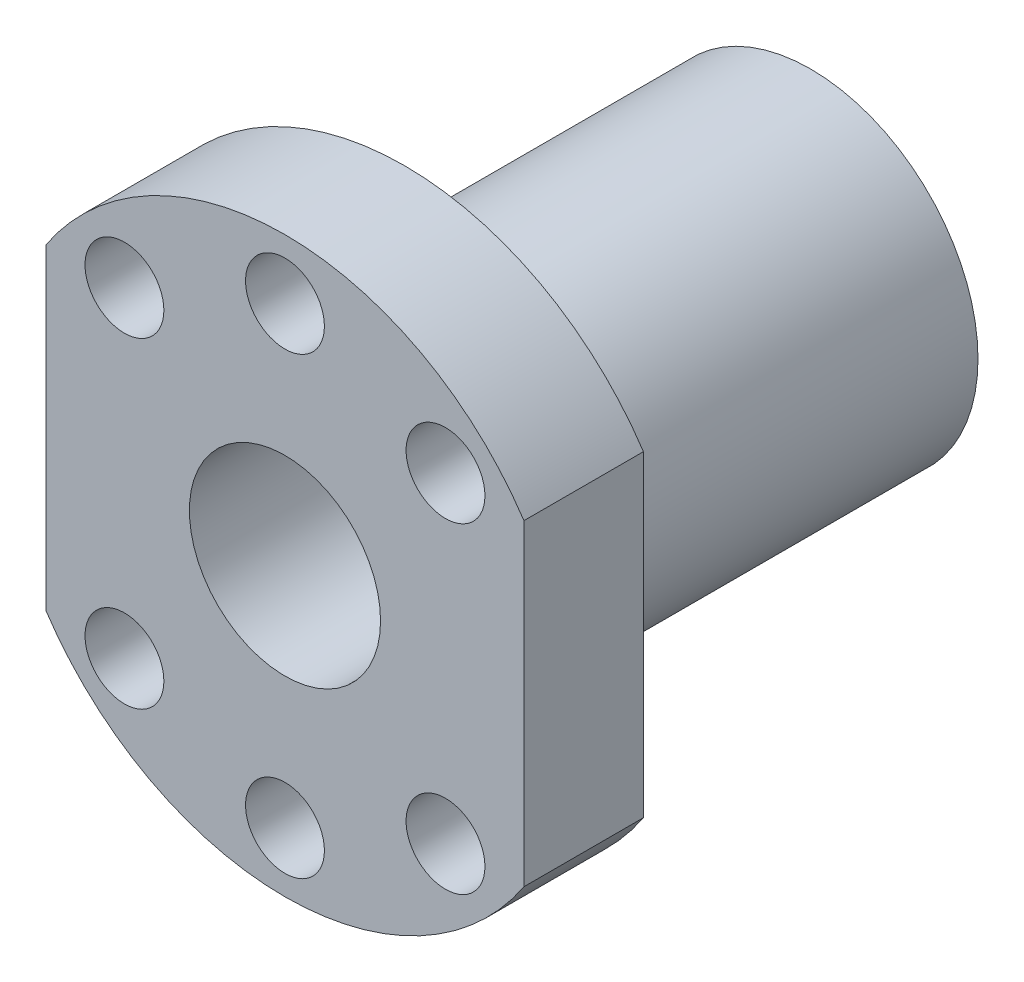
ISO-10303-21;
HEADER;
FILE_DESCRIPTION(('STEP AP214'),'2;1');
FILE_NAME('part.step','',(''),(''),'','','');
FILE_SCHEMA(('AUTOMOTIVE_DESIGN { 1 0 10303 214 1 1 1 1 }'));
ENDSEC;
DATA;
#1=APPLICATION_CONTEXT('core data for automotive mechanical design processes');
#2=APPLICATION_PROTOCOL_DEFINITION('international standard','automotive_design',2000,#1);
#3=PRODUCT_CONTEXT('',#1,'mechanical');
#4=PRODUCT('Part','Part','',(#3));
#5=PRODUCT_RELATED_PRODUCT_CATEGORY('part','',(#4));
#6=PRODUCT_DEFINITION_FORMATION('','',#4);
#7=PRODUCT_DEFINITION_CONTEXT('part definition',#1,'design');
#8=PRODUCT_DEFINITION('design','',#6,#7);
#9=PRODUCT_DEFINITION_SHAPE('','',#8);
#10=(LENGTH_UNIT() NAMED_UNIT(*) SI_UNIT(.MILLI.,.METRE.));
#11=(NAMED_UNIT(*) PLANE_ANGLE_UNIT() SI_UNIT($,.RADIAN.));
#12=(NAMED_UNIT(*) SI_UNIT($,.STERADIAN.) SOLID_ANGLE_UNIT());
#13=UNCERTAINTY_MEASURE_WITH_UNIT(LENGTH_MEASURE(1.E-05),#10,'distance_accuracy_value','');
#14=(GEOMETRIC_REPRESENTATION_CONTEXT(3) GLOBAL_UNCERTAINTY_ASSIGNED_CONTEXT((#13)) GLOBAL_UNIT_ASSIGNED_CONTEXT((#10,
#11,#12)) REPRESENTATION_CONTEXT('',''));
#15=CARTESIAN_POINT('',(0.,0.,0.));
#16=DIRECTION('',(0.,0.,1.));
#17=DIRECTION('',(1.,0.,0.));
#18=AXIS2_PLACEMENT_3D('',#15,#16,#17);
#19=CARTESIAN_POINT('',(0.,24.,0.));
#20=DIRECTION('',(0.,0.,-1.));
#21=DIRECTION('',(-1.,0.,0.));
#22=AXIS2_PLACEMENT_3D('',#19,#20,#21);
#23=PLANE('',#22);
#24=CARTESIAN_POINT('',(0.,-19.,0.));
#25=DIRECTION('',(0.,0.,-1.));
#26=DIRECTION('',(1.,0.,0.));
#27=AXIS2_PLACEMENT_3D('',#24,#25,#26);
#28=CIRCLE('',#27,3.3);
#29=CARTESIAN_POINT('',(3.3,-19.,0.));
#30=VERTEX_POINT('',#29);
#31=EDGE_CURVE('E127',#30,#30,#28,.T.);
#32=ORIENTED_EDGE('',*,*,#31,.T.);
#33=EDGE_LOOP('',(#32));
#34=FACE_BOUND('',#33,.T.);
#35=CARTESIAN_POINT('',(0.,0.,0.));
#36=DIRECTION('',(0.,0.,1.));
#37=DIRECTION('',(1.,0.,0.));
#38=AXIS2_PLACEMENT_3D('',#35,#36,#37);
#39=CIRCLE('',#38,24.);
#40=CARTESIAN_POINT('',(20.,13.2664991614216,0.));
#41=VERTEX_POINT('',#40);
#42=CARTESIAN_POINT('',(-20.,13.2664991614216,0.));
#43=VERTEX_POINT('',#42);
#44=EDGE_CURVE('E87',#41,#43,#39,.T.);
#45=ORIENTED_EDGE('',*,*,#44,.T.);
#46=DIRECTION('',(0.,1.,0.));
#47=VECTOR('',#46,1.);
#48=CARTESIAN_POINT('',(-20.,13.2664991614216,0.));
#49=LINE('',#48,#47);
#50=CARTESIAN_POINT('',(-20.,-13.2664991614216,0.));
#51=VERTEX_POINT('',#50);
#52=EDGE_CURVE('E74',#51,#43,#49,.T.);
#53=ORIENTED_EDGE('',*,*,#52,.F.);
#54=CARTESIAN_POINT('',(20.,-13.2664991614216,0.));
#55=VERTEX_POINT('',#54);
#56=EDGE_CURVE('E84',#51,#55,#39,.T.);
#57=ORIENTED_EDGE('',*,*,#56,.T.);
#58=DIRECTION('',(0.,-1.,0.));
#59=VECTOR('',#58,1.);
#60=CARTESIAN_POINT('',(20.,-13.2664991614216,0.));
#61=LINE('',#60,#59);
#62=EDGE_CURVE('E94',#41,#55,#61,.T.);
#63=ORIENTED_EDGE('',*,*,#62,.F.);
#64=EDGE_LOOP('',(#45,#53,#57,#63));
#65=FACE_BOUND('',#64,.T.);
#66=CARTESIAN_POINT('',(-13.4350288425444,13.4350288425444,0.));
#67=DIRECTION('',(0.,0.,1.));
#68=DIRECTION('',(1.,0.,0.));
#69=AXIS2_PLACEMENT_3D('',#66,#67,#68);
#70=CIRCLE('',#69,3.3);
#71=CARTESIAN_POINT('',(-10.1350288425444,13.4350288425444,0.));
#72=VERTEX_POINT('',#71);
#73=EDGE_CURVE('E112',#72,#72,#70,.T.);
#74=ORIENTED_EDGE('',*,*,#73,.F.);
#75=EDGE_LOOP('',(#74));
#76=FACE_BOUND('',#75,.T.);
#77=CARTESIAN_POINT('',(0.,19.,0.));
#78=DIRECTION('',(0.,0.,1.));
#79=DIRECTION('',(1.,0.,0.));
#80=AXIS2_PLACEMENT_3D('',#77,#78,#79);
#81=CIRCLE('',#80,3.3);
#82=CARTESIAN_POINT('',(3.3,19.,0.));
#83=VERTEX_POINT('',#82);
#84=EDGE_CURVE('E116',#83,#83,#81,.T.);
#85=ORIENTED_EDGE('',*,*,#84,.F.);
#86=EDGE_LOOP('',(#85));
#87=FACE_BOUND('',#86,.T.);
#88=CARTESIAN_POINT('',(13.4350288425444,13.4350288425444,0.));
#89=DIRECTION('',(0.,0.,1.));
#90=DIRECTION('',(1.,0.,0.));
#91=AXIS2_PLACEMENT_3D('',#88,#89,#90);
#92=CIRCLE('',#91,3.3);
#93=CARTESIAN_POINT('',(16.7350288425444,13.4350288425444,0.));
#94=VERTEX_POINT('',#93);
#95=EDGE_CURVE('E120',#94,#94,#92,.T.);
#96=ORIENTED_EDGE('',*,*,#95,.F.);
#97=EDGE_LOOP('',(#96));
#98=FACE_BOUND('',#97,.T.);
#99=CARTESIAN_POINT('',(0.,0.,0.));
#100=DIRECTION('',(0.,0.,1.));
#101=DIRECTION('',(1.,0.,0.));
#102=AXIS2_PLACEMENT_3D('',#99,#100,#101);
#103=CIRCLE('',#102,8.);
#104=CARTESIAN_POINT('',(8.,0.,0.));
#105=VERTEX_POINT('',#104);
#106=EDGE_CURVE('E123',#105,#105,#103,.T.);
#107=ORIENTED_EDGE('',*,*,#106,.F.);
#108=EDGE_LOOP('',(#107));
#109=FACE_BOUND('',#108,.T.);
#110=CARTESIAN_POINT('',(-13.4350288425444,-13.4350288425444,0.));
#111=DIRECTION('',(0.,0.,-1.));
#112=DIRECTION('',(1.,0.,0.));
#113=AXIS2_PLACEMENT_3D('',#110,#111,#112);
#114=CIRCLE('',#113,3.3);
#115=CARTESIAN_POINT('',(-10.1350288425444,-13.4350288425444,0.));
#116=VERTEX_POINT('',#115);
#117=EDGE_CURVE('E124',#116,#116,#114,.T.);
#118=ORIENTED_EDGE('',*,*,#117,.T.);
#119=EDGE_LOOP('',(#118));
#120=FACE_BOUND('',#119,.T.);
#121=CARTESIAN_POINT('',(13.4350288425444,-13.4350288425444,0.));
#122=DIRECTION('',(0.,0.,-1.));
#123=DIRECTION('',(1.,0.,0.));
#124=AXIS2_PLACEMENT_3D('',#121,#122,#123);
#125=CIRCLE('',#124,3.3);
#126=CARTESIAN_POINT('',(16.7350288425444,-13.4350288425444,0.));
#127=VERTEX_POINT('',#126);
#128=EDGE_CURVE('E137',#127,#127,#125,.T.);
#129=ORIENTED_EDGE('',*,*,#128,.T.);
#130=EDGE_LOOP('',(#129));
#131=FACE_BOUND('',#130,.T.);
#132=ADVANCED_FACE('F32',(#34,#65,#76,#87,#98,#109,#120,#131),#23,.F.);
#133=CARTESIAN_POINT('',(0.,14.,-10.));
#134=DIRECTION('',(0.,0.,1.));
#135=DIRECTION('',(1.,0.,0.));
#136=AXIS2_PLACEMENT_3D('',#133,#134,#135);
#137=PLANE('',#136);
#138=CARTESIAN_POINT('',(0.,-19.,-10.));
#139=DIRECTION('',(0.,0.,1.));
#140=DIRECTION('',(1.,0.,0.));
#141=AXIS2_PLACEMENT_3D('',#138,#139,#140);
#142=CIRCLE('',#141,3.3);
#143=CARTESIAN_POINT('',(3.3,-19.,-10.));
#144=VERTEX_POINT('',#143);
#145=EDGE_CURVE('E125',#144,#144,#142,.F.);
#146=ORIENTED_EDGE('',*,*,#145,.F.);
#147=EDGE_LOOP('',(#146));
#148=FACE_BOUND('',#147,.T.);
#149=CARTESIAN_POINT('',(0.,0.,-10.));
#150=DIRECTION('',(0.,0.,1.));
#151=DIRECTION('',(1.,0.,0.));
#152=AXIS2_PLACEMENT_3D('',#149,#150,#151);
#153=CIRCLE('',#152,14.);
#154=CARTESIAN_POINT('',(14.,0.,-10.));
#155=VERTEX_POINT('',#154);
#156=EDGE_CURVE('E101',#155,#155,#153,.T.);
#157=ORIENTED_EDGE('',*,*,#156,.T.);
#158=EDGE_LOOP('',(#157));
#159=FACE_BOUND('',#158,.T.);
#160=CARTESIAN_POINT('',(0.,0.,-10.));
#161=DIRECTION('',(0.,0.,1.));
#162=DIRECTION('',(1.,0.,0.));
#163=AXIS2_PLACEMENT_3D('',#160,#161,#162);
#164=CIRCLE('',#163,24.);
#165=CARTESIAN_POINT('',(-20.,-13.2664991614216,-10.));
#166=VERTEX_POINT('',#165);
#167=CARTESIAN_POINT('',(20.,-13.2664991614216,-10.));
#168=VERTEX_POINT('',#167);
#169=EDGE_CURVE('E93',#166,#168,#164,.T.);
#170=ORIENTED_EDGE('',*,*,#169,.F.);
#171=DIRECTION('',(0.,1.,0.));
#172=VECTOR('',#171,1.);
#173=CARTESIAN_POINT('',(-20.,14.,-10.));
#174=LINE('',#173,#172);
#175=CARTESIAN_POINT('',(-20.,13.2664991614216,-10.));
#176=VERTEX_POINT('',#175);
#177=EDGE_CURVE('E48',#166,#176,#174,.T.);
#178=ORIENTED_EDGE('',*,*,#177,.T.);
#179=CARTESIAN_POINT('',(20.,13.2664991614216,-10.));
#180=VERTEX_POINT('',#179);
#181=EDGE_CURVE('E98',#180,#176,#164,.T.);
#182=ORIENTED_EDGE('',*,*,#181,.F.);
#183=DIRECTION('',(0.,-1.,0.));
#184=VECTOR('',#183,1.);
#185=CARTESIAN_POINT('',(20.,14.,-10.));
#186=LINE('',#185,#184);
#187=EDGE_CURVE('E56',#180,#168,#186,.T.);
#188=ORIENTED_EDGE('',*,*,#187,.T.);
#189=EDGE_LOOP('',(#170,#178,#182,#188));
#190=FACE_BOUND('',#189,.T.);
#191=CARTESIAN_POINT('',(-13.4350288425444,13.4350288425444,-10.));
#192=DIRECTION('',(0.,0.,1.));
#193=DIRECTION('',(1.,0.,0.));
#194=AXIS2_PLACEMENT_3D('',#191,#192,#193);
#195=CIRCLE('',#194,3.3);
#196=CARTESIAN_POINT('',(-10.1350288425444,13.4350288425444,-10.));
#197=VERTEX_POINT('',#196);
#198=EDGE_CURVE('E110',#197,#197,#195,.T.);
#199=ORIENTED_EDGE('',*,*,#198,.T.);
#200=EDGE_LOOP('',(#199));
#201=FACE_BOUND('',#200,.T.);
#202=CARTESIAN_POINT('',(0.,19.,-10.));
#203=DIRECTION('',(0.,0.,1.));
#204=DIRECTION('',(1.,0.,0.));
#205=AXIS2_PLACEMENT_3D('',#202,#203,#204);
#206=CIRCLE('',#205,3.3);
#207=CARTESIAN_POINT('',(3.3,19.,-10.));
#208=VERTEX_POINT('',#207);
#209=EDGE_CURVE('E88',#208,#208,#206,.T.);
#210=ORIENTED_EDGE('',*,*,#209,.T.);
#211=EDGE_LOOP('',(#210));
#212=FACE_BOUND('',#211,.T.);
#213=CARTESIAN_POINT('',(13.4350288425444,13.4350288425444,-10.));
#214=DIRECTION('',(0.,0.,1.));
#215=DIRECTION('',(1.,0.,0.));
#216=AXIS2_PLACEMENT_3D('',#213,#214,#215);
#217=CIRCLE('',#216,3.3);
#218=CARTESIAN_POINT('',(16.7350288425444,13.4350288425444,-10.));
#219=VERTEX_POINT('',#218);
#220=EDGE_CURVE('E117',#219,#219,#217,.T.);
#221=ORIENTED_EDGE('',*,*,#220,.T.);
#222=EDGE_LOOP('',(#221));
#223=FACE_BOUND('',#222,.T.);
#224=CARTESIAN_POINT('',(-13.4350288425444,-13.4350288425444,-10.));
#225=DIRECTION('',(0.,0.,1.));
#226=DIRECTION('',(1.,0.,0.));
#227=AXIS2_PLACEMENT_3D('',#224,#225,#226);
#228=CIRCLE('',#227,3.3);
#229=CARTESIAN_POINT('',(-10.1350288425444,-13.4350288425444,-10.));
#230=VERTEX_POINT('',#229);
#231=EDGE_CURVE('E121',#230,#230,#228,.F.);
#232=ORIENTED_EDGE('',*,*,#231,.F.);
#233=EDGE_LOOP('',(#232));
#234=FACE_BOUND('',#233,.T.);
#235=CARTESIAN_POINT('',(13.4350288425444,-13.4350288425444,-10.));
#236=DIRECTION('',(0.,0.,1.));
#237=DIRECTION('',(1.,0.,0.));
#238=AXIS2_PLACEMENT_3D('',#235,#236,#237);
#239=CIRCLE('',#238,3.3);
#240=CARTESIAN_POINT('',(16.7350288425444,-13.4350288425444,-10.));
#241=VERTEX_POINT('',#240);
#242=EDGE_CURVE('E35',#241,#241,#239,.F.);
#243=ORIENTED_EDGE('',*,*,#242,.F.);
#244=EDGE_LOOP('',(#243));
#245=FACE_BOUND('',#244,.T.);
#246=ADVANCED_FACE('F156',(#148,#159,#190,#201,#212,#223,#234,#245),#137,.F.);
#247=CARTESIAN_POINT('',(0.,0.,0.));
#248=DIRECTION('',(0.,0.,1.));
#249=DIRECTION('',(1.,0.,0.));
#250=AXIS2_PLACEMENT_3D('',#247,#248,#249);
#251=CYLINDRICAL_SURFACE('',#250,24.);
#252=ORIENTED_EDGE('',*,*,#181,.T.);
#253=DIRECTION('',(0.,0.,1.));
#254=VECTOR('',#253,1.);
#255=CARTESIAN_POINT('',(-20.,13.2664991614216,0.));
#256=LINE('',#255,#254);
#257=EDGE_CURVE('E11',#176,#43,#256,.T.);
#258=ORIENTED_EDGE('',*,*,#257,.T.);
#259=ORIENTED_EDGE('',*,*,#44,.F.);
#260=DIRECTION('',(0.,0.,1.));
#261=VECTOR('',#260,1.);
#262=CARTESIAN_POINT('',(20.,13.2664991614216,0.));
#263=LINE('',#262,#261);
#264=EDGE_CURVE('E107',#41,#180,#263,.F.);
#265=ORIENTED_EDGE('',*,*,#264,.T.);
#266=EDGE_LOOP('',(#252,#258,#259,#265));
#267=FACE_BOUND('',#266,.T.);
#268=ADVANCED_FACE('F153',(#267),#251,.T.);
#269=CARTESIAN_POINT('',(0.,0.,-44.));
#270=DIRECTION('',(0.,0.,1.));
#271=DIRECTION('',(1.,0.,0.));
#272=AXIS2_PLACEMENT_3D('',#269,#270,#271);
#273=PLANE('',#272);
#274=CARTESIAN_POINT('',(0.,0.,-44.));
#275=DIRECTION('',(0.,0.,1.));
#276=DIRECTION('',(1.,0.,0.));
#277=AXIS2_PLACEMENT_3D('',#274,#275,#276);
#278=CIRCLE('',#277,8.);
#279=CARTESIAN_POINT('',(8.,0.,-44.));
#280=VERTEX_POINT('',#279);
#281=EDGE_CURVE('E140',#280,#280,#278,.T.);
#282=ORIENTED_EDGE('',*,*,#281,.T.);
#283=EDGE_LOOP('',(#282));
#284=FACE_BOUND('',#283,.T.);
#285=CARTESIAN_POINT('',(0.,0.,-44.));
#286=DIRECTION('',(0.,0.,1.));
#287=DIRECTION('',(1.,0.,0.));
#288=AXIS2_PLACEMENT_3D('',#285,#286,#287);
#289=CIRCLE('',#288,14.);
#290=CARTESIAN_POINT('',(14.,0.,-44.));
#291=VERTEX_POINT('',#290);
#292=EDGE_CURVE('E104',#291,#291,#289,.T.);
#293=ORIENTED_EDGE('',*,*,#292,.F.);
#294=EDGE_LOOP('',(#293));
#295=FACE_BOUND('',#294,.T.);
#296=ADVANCED_FACE('F198',(#284,#295),#273,.F.);
#297=CARTESIAN_POINT('',(0.,0.,0.));
#298=DIRECTION('',(0.,0.,1.));
#299=DIRECTION('',(1.,0.,0.));
#300=AXIS2_PLACEMENT_3D('',#297,#298,#299);
#301=CYLINDRICAL_SURFACE('',#300,14.);
#302=ORIENTED_EDGE('',*,*,#156,.F.);
#303=EDGE_LOOP('',(#302));
#304=FACE_BOUND('',#303,.T.);
#305=ORIENTED_EDGE('',*,*,#292,.T.);
#306=EDGE_LOOP('',(#305));
#307=FACE_BOUND('',#306,.T.);
#308=ADVANCED_FACE('F206',(#304,#307),#301,.T.);
#309=ORIENTED_EDGE('',*,*,#56,.F.);
#310=DIRECTION('',(0.,0.,1.));
#311=VECTOR('',#310,1.);
#312=CARTESIAN_POINT('',(-20.,-13.2664991614216,0.));
#313=LINE('',#312,#311);
#314=EDGE_CURVE('E40',#51,#166,#313,.F.);
#315=ORIENTED_EDGE('',*,*,#314,.T.);
#316=ORIENTED_EDGE('',*,*,#169,.T.);
#317=DIRECTION('',(0.,0.,1.));
#318=VECTOR('',#317,1.);
#319=CARTESIAN_POINT('',(20.,-13.2664991614216,0.));
#320=LINE('',#319,#318);
#321=EDGE_CURVE('E78',#168,#55,#320,.T.);
#322=ORIENTED_EDGE('',*,*,#321,.T.);
#323=EDGE_LOOP('',(#309,#315,#316,#322));
#324=FACE_BOUND('',#323,.T.);
#325=ADVANCED_FACE('F91',(#324),#251,.T.);
#326=CARTESIAN_POINT('',(20.,-13.2664991614216,-44.));
#327=DIRECTION('',(-1.,0.,0.));
#328=DIRECTION('',(0.,0.,1.));
#329=AXIS2_PLACEMENT_3D('',#326,#327,#328);
#330=PLANE('',#329);
#331=ORIENTED_EDGE('',*,*,#264,.F.);
#332=ORIENTED_EDGE('',*,*,#62,.T.);
#333=ORIENTED_EDGE('',*,*,#321,.F.);
#334=ORIENTED_EDGE('',*,*,#187,.F.);
#335=EDGE_LOOP('',(#331,#332,#333,#334));
#336=FACE_BOUND('',#335,.T.);
#337=ADVANCED_FACE('F151',(#336),#330,.F.);
#338=CARTESIAN_POINT('',(-13.4350288425444,13.4350288425444,-44.));
#339=DIRECTION('',(0.,0.,1.));
#340=DIRECTION('',(1.,0.,0.));
#341=AXIS2_PLACEMENT_3D('',#338,#339,#340);
#342=CYLINDRICAL_SURFACE('',#341,3.3);
#343=ORIENTED_EDGE('',*,*,#73,.T.);
#344=EDGE_LOOP('',(#343));
#345=FACE_BOUND('',#344,.T.);
#346=ORIENTED_EDGE('',*,*,#198,.F.);
#347=EDGE_LOOP('',(#346));
#348=FACE_BOUND('',#347,.T.);
#349=ADVANCED_FACE('F224',(#345,#348),#342,.F.);
#350=CARTESIAN_POINT('',(-20.,13.2664991614216,-44.));
#351=DIRECTION('',(1.,0.,0.));
#352=DIRECTION('',(0.,1.,0.));
#353=AXIS2_PLACEMENT_3D('',#350,#351,#352);
#354=PLANE('',#353);
#355=ORIENTED_EDGE('',*,*,#314,.F.);
#356=ORIENTED_EDGE('',*,*,#52,.T.);
#357=ORIENTED_EDGE('',*,*,#257,.F.);
#358=ORIENTED_EDGE('',*,*,#177,.F.);
#359=EDGE_LOOP('',(#355,#356,#357,#358));
#360=FACE_BOUND('',#359,.T.);
#361=ADVANCED_FACE('F73',(#360),#354,.F.);
#362=CARTESIAN_POINT('',(0.,19.,-44.));
#363=DIRECTION('',(0.,0.,1.));
#364=DIRECTION('',(1.,0.,0.));
#365=AXIS2_PLACEMENT_3D('',#362,#363,#364);
#366=CYLINDRICAL_SURFACE('',#365,3.3);
#367=ORIENTED_EDGE('',*,*,#84,.T.);
#368=EDGE_LOOP('',(#367));
#369=FACE_BOUND('',#368,.T.);
#370=ORIENTED_EDGE('',*,*,#209,.F.);
#371=EDGE_LOOP('',(#370));
#372=FACE_BOUND('',#371,.T.);
#373=ADVANCED_FACE('F238',(#369,#372),#366,.F.);
#374=CARTESIAN_POINT('',(13.4350288425444,13.4350288425444,-44.));
#375=DIRECTION('',(0.,0.,1.));
#376=DIRECTION('',(1.,0.,0.));
#377=AXIS2_PLACEMENT_3D('',#374,#375,#376);
#378=CYLINDRICAL_SURFACE('',#377,3.3);
#379=ORIENTED_EDGE('',*,*,#95,.T.);
#380=EDGE_LOOP('',(#379));
#381=FACE_BOUND('',#380,.T.);
#382=ORIENTED_EDGE('',*,*,#220,.F.);
#383=EDGE_LOOP('',(#382));
#384=FACE_BOUND('',#383,.T.);
#385=ADVANCED_FACE('F245',(#381,#384),#378,.F.);
#386=CARTESIAN_POINT('',(0.,0.,-44.));
#387=DIRECTION('',(0.,0.,1.));
#388=DIRECTION('',(1.,0.,0.));
#389=AXIS2_PLACEMENT_3D('',#386,#387,#388);
#390=CYLINDRICAL_SURFACE('',#389,8.);
#391=ORIENTED_EDGE('',*,*,#281,.F.);
#392=EDGE_LOOP('',(#391));
#393=FACE_BOUND('',#392,.T.);
#394=ORIENTED_EDGE('',*,*,#106,.T.);
#395=EDGE_LOOP('',(#394));
#396=FACE_BOUND('',#395,.T.);
#397=ADVANCED_FACE('F253',(#393,#396),#390,.F.);
#398=CARTESIAN_POINT('',(-13.4350288425444,-13.4350288425444,-44.));
#399=DIRECTION('',(0.,0.,1.));
#400=DIRECTION('',(1.,0.,0.));
#401=AXIS2_PLACEMENT_3D('',#398,#399,#400);
#402=CYLINDRICAL_SURFACE('',#401,3.3);
#403=ORIENTED_EDGE('',*,*,#117,.F.);
#404=EDGE_LOOP('',(#403));
#405=FACE_BOUND('',#404,.T.);
#406=ORIENTED_EDGE('',*,*,#231,.T.);
#407=EDGE_LOOP('',(#406));
#408=FACE_BOUND('',#407,.T.);
#409=ADVANCED_FACE('F179',(#405,#408),#402,.F.);
#410=CARTESIAN_POINT('',(0.,-19.,-44.));
#411=DIRECTION('',(0.,0.,1.));
#412=DIRECTION('',(1.,0.,0.));
#413=AXIS2_PLACEMENT_3D('',#410,#411,#412);
#414=CYLINDRICAL_SURFACE('',#413,3.3);
#415=ORIENTED_EDGE('',*,*,#31,.F.);
#416=EDGE_LOOP('',(#415));
#417=FACE_BOUND('',#416,.T.);
#418=ORIENTED_EDGE('',*,*,#145,.T.);
#419=EDGE_LOOP('',(#418));
#420=FACE_BOUND('',#419,.T.);
#421=ADVANCED_FACE('F173',(#417,#420),#414,.F.);
#422=CARTESIAN_POINT('',(13.4350288425444,-13.4350288425444,-44.));
#423=DIRECTION('',(0.,0.,1.));
#424=DIRECTION('',(1.,0.,0.));
#425=AXIS2_PLACEMENT_3D('',#422,#423,#424);
#426=CYLINDRICAL_SURFACE('',#425,3.3);
#427=ORIENTED_EDGE('',*,*,#128,.F.);
#428=EDGE_LOOP('',(#427));
#429=FACE_BOUND('',#428,.T.);
#430=ORIENTED_EDGE('',*,*,#242,.T.);
#431=EDGE_LOOP('',(#430));
#432=FACE_BOUND('',#431,.T.);
#433=ADVANCED_FACE('F171',(#429,#432),#426,.F.);
#434=CLOSED_SHELL('',(#132,#246,#268,#296,#308,#325,#337,#349,#361,#373,#385,#397,#409,#421,#433));
#435=MANIFOLD_SOLID_BREP('B2',#434);
#436=ADVANCED_BREP_SHAPE_REPRESENTATION('',(#18,#435),#14);
#437=SHAPE_DEFINITION_REPRESENTATION(#9,#436);
ENDSEC;
END-ISO-10303-21;
